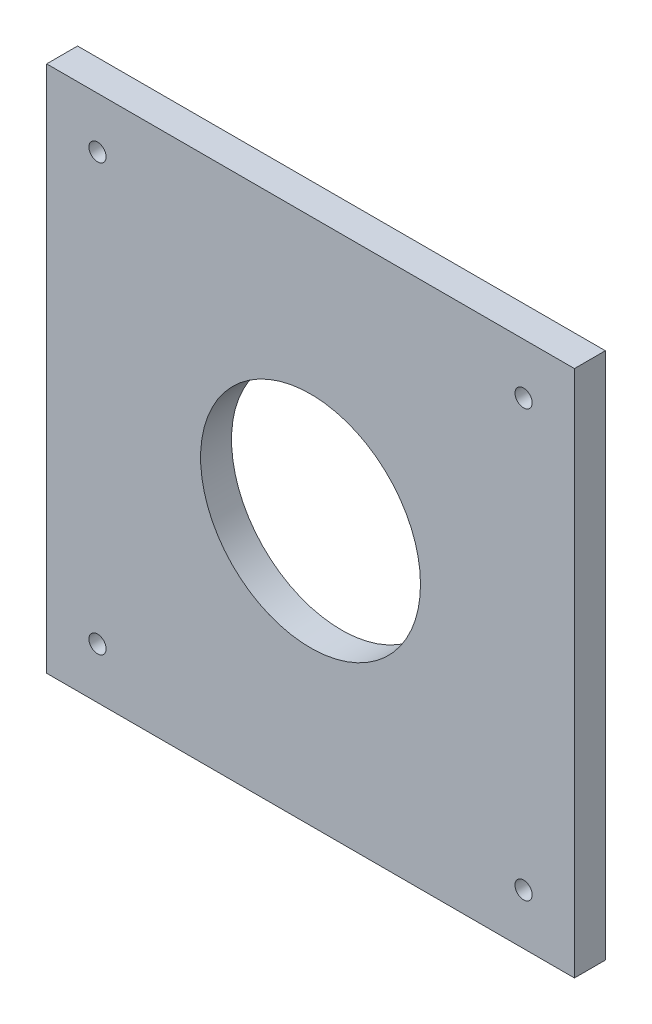
ISO-10303-21;
HEADER;
FILE_DESCRIPTION(('STEP AP214'),'2;1');
FILE_NAME('part.step','',(''),(''),'','','');
FILE_SCHEMA(('AUTOMOTIVE_DESIGN { 1 0 10303 214 1 1 1 1 }'));
ENDSEC;
DATA;
#1=APPLICATION_CONTEXT('core data for automotive mechanical design processes');
#2=APPLICATION_PROTOCOL_DEFINITION('international standard','automotive_design',2000,#1);
#3=PRODUCT_CONTEXT('',#1,'mechanical');
#4=PRODUCT('Part','Part','',(#3));
#5=PRODUCT_RELATED_PRODUCT_CATEGORY('part','',(#4));
#6=PRODUCT_DEFINITION_FORMATION('','',#4);
#7=PRODUCT_DEFINITION_CONTEXT('part definition',#1,'design');
#8=PRODUCT_DEFINITION('design','',#6,#7);
#9=PRODUCT_DEFINITION_SHAPE('','',#8);
#10=(LENGTH_UNIT() NAMED_UNIT(*) SI_UNIT(.MILLI.,.METRE.));
#11=(NAMED_UNIT(*) PLANE_ANGLE_UNIT() SI_UNIT($,.RADIAN.));
#12=(NAMED_UNIT(*) SI_UNIT($,.STERADIAN.) SOLID_ANGLE_UNIT());
#13=UNCERTAINTY_MEASURE_WITH_UNIT(LENGTH_MEASURE(1.E-05),#10,'distance_accuracy_value','');
#14=(GEOMETRIC_REPRESENTATION_CONTEXT(3) GLOBAL_UNCERTAINTY_ASSIGNED_CONTEXT((#13)) GLOBAL_UNIT_ASSIGNED_CONTEXT((#10,
#11,#12)) REPRESENTATION_CONTEXT('',''));
#15=CARTESIAN_POINT('',(0.,0.,0.));
#16=DIRECTION('',(0.,0.,1.));
#17=DIRECTION('',(1.,0.,0.));
#18=AXIS2_PLACEMENT_3D('',#15,#16,#17);
#19=CARTESIAN_POINT('',(0.,0.,4.5));
#20=DIRECTION('',(0.,0.,-1.));
#21=DIRECTION('',(-1.,0.,0.));
#22=AXIS2_PLACEMENT_3D('',#19,#20,#21);
#23=PLANE('',#22);
#24=DIRECTION('',(0.,-1.,0.));
#25=VECTOR('',#24,1.);
#26=CARTESIAN_POINT('',(0.,0.,4.5));
#27=LINE('',#26,#25);
#28=CARTESIAN_POINT('',(0.,76.8,4.5));
#29=VERTEX_POINT('',#28);
#30=CARTESIAN_POINT('',(0.,0.,4.5));
#31=VERTEX_POINT('',#30);
#32=EDGE_CURVE('E69',#29,#31,#27,.T.);
#33=ORIENTED_EDGE('',*,*,#32,.T.);
#34=DIRECTION('',(1.,0.,0.));
#35=VECTOR('',#34,1.);
#36=CARTESIAN_POINT('',(0.,0.,4.5));
#37=LINE('',#36,#35);
#38=CARTESIAN_POINT('',(76.8,0.,4.5));
#39=VERTEX_POINT('',#38);
#40=EDGE_CURVE('E64',#31,#39,#37,.T.);
#41=ORIENTED_EDGE('',*,*,#40,.T.);
#42=DIRECTION('',(0.,1.,0.));
#43=VECTOR('',#42,1.);
#44=CARTESIAN_POINT('',(76.8,0.,4.5));
#45=LINE('',#44,#43);
#46=CARTESIAN_POINT('',(76.8,76.8,4.5));
#47=VERTEX_POINT('',#46);
#48=EDGE_CURVE('E67',#39,#47,#45,.T.);
#49=ORIENTED_EDGE('',*,*,#48,.T.);
#50=DIRECTION('',(-1.,0.,0.));
#51=VECTOR('',#50,1.);
#52=CARTESIAN_POINT('',(0.,76.8,4.5));
#53=LINE('',#52,#51);
#54=EDGE_CURVE('E34',#47,#29,#53,.T.);
#55=ORIENTED_EDGE('',*,*,#54,.T.);
#56=EDGE_LOOP('',(#33,#41,#49,#55));
#57=FACE_BOUND('',#56,.T.);
#58=CARTESIAN_POINT('',(7.4,7.4,4.5));
#59=DIRECTION('',(0.,0.,1.));
#60=DIRECTION('',(1.,0.,0.));
#61=AXIS2_PLACEMENT_3D('',#58,#59,#60);
#62=CIRCLE('',#61,1.25);
#63=CARTESIAN_POINT('',(8.65,7.4,4.5));
#64=VERTEX_POINT('',#63);
#65=EDGE_CURVE('E84',#64,#64,#62,.T.);
#66=ORIENTED_EDGE('',*,*,#65,.F.);
#67=EDGE_LOOP('',(#66));
#68=FACE_BOUND('',#67,.T.);
#69=CARTESIAN_POINT('',(38.4,38.4,4.5));
#70=DIRECTION('',(0.,0.,1.));
#71=DIRECTION('',(1.,0.,0.));
#72=AXIS2_PLACEMENT_3D('',#69,#70,#71);
#73=CIRCLE('',#72,16.);
#74=CARTESIAN_POINT('',(54.4,38.4,4.5));
#75=VERTEX_POINT('',#74);
#76=EDGE_CURVE('E99',#75,#75,#73,.T.);
#77=ORIENTED_EDGE('',*,*,#76,.F.);
#78=EDGE_LOOP('',(#77));
#79=FACE_BOUND('',#78,.T.);
#80=CARTESIAN_POINT('',(69.4,7.4,4.5));
#81=DIRECTION('',(0.,0.,1.));
#82=DIRECTION('',(1.,0.,0.));
#83=AXIS2_PLACEMENT_3D('',#80,#81,#82);
#84=CIRCLE('',#83,1.25);
#85=CARTESIAN_POINT('',(70.65,7.4,4.5));
#86=VERTEX_POINT('',#85);
#87=EDGE_CURVE('E105',#86,#86,#84,.T.);
#88=ORIENTED_EDGE('',*,*,#87,.F.);
#89=EDGE_LOOP('',(#88));
#90=FACE_BOUND('',#89,.T.);
#91=CARTESIAN_POINT('',(69.4,69.4,4.5));
#92=DIRECTION('',(0.,0.,1.));
#93=DIRECTION('',(1.,0.,0.));
#94=AXIS2_PLACEMENT_3D('',#91,#92,#93);
#95=CIRCLE('',#94,1.25);
#96=CARTESIAN_POINT('',(70.65,69.4,4.5));
#97=VERTEX_POINT('',#96);
#98=EDGE_CURVE('E111',#97,#97,#95,.T.);
#99=ORIENTED_EDGE('',*,*,#98,.F.);
#100=EDGE_LOOP('',(#99));
#101=FACE_BOUND('',#100,.T.);
#102=CARTESIAN_POINT('',(7.39999999999979,69.4,4.5));
#103=DIRECTION('',(0.,0.,1.));
#104=DIRECTION('',(1.,0.,0.));
#105=AXIS2_PLACEMENT_3D('',#102,#103,#104);
#106=CIRCLE('',#105,1.25);
#107=CARTESIAN_POINT('',(8.64999999999979,69.4,4.5));
#108=VERTEX_POINT('',#107);
#109=EDGE_CURVE('E117',#108,#108,#106,.T.);
#110=ORIENTED_EDGE('',*,*,#109,.F.);
#111=EDGE_LOOP('',(#110));
#112=FACE_BOUND('',#111,.T.);
#113=ADVANCED_FACE('F17',(#57,#68,#79,#90,#101,#112),#23,.F.);
#114=CARTESIAN_POINT('',(0.,0.,0.));
#115=DIRECTION('',(0.,0.,-1.));
#116=DIRECTION('',(-1.,0.,0.));
#117=AXIS2_PLACEMENT_3D('',#114,#115,#116);
#118=PLANE('',#117);
#119=CARTESIAN_POINT('',(69.4,69.4,0.));
#120=DIRECTION('',(0.,0.,1.));
#121=DIRECTION('',(1.,0.,0.));
#122=AXIS2_PLACEMENT_3D('',#119,#120,#121);
#123=CIRCLE('',#122,1.25);
#124=CARTESIAN_POINT('',(70.65,69.4,0.));
#125=VERTEX_POINT('',#124);
#126=EDGE_CURVE('E114',#125,#125,#123,.T.);
#127=ORIENTED_EDGE('',*,*,#126,.T.);
#128=EDGE_LOOP('',(#127));
#129=FACE_BOUND('',#128,.T.);
#130=CARTESIAN_POINT('',(38.4,38.4,0.));
#131=DIRECTION('',(0.,0.,1.));
#132=DIRECTION('',(1.,0.,0.));
#133=AXIS2_PLACEMENT_3D('',#130,#131,#132);
#134=CIRCLE('',#133,16.);
#135=CARTESIAN_POINT('',(54.4,38.4,0.));
#136=VERTEX_POINT('',#135);
#137=EDGE_CURVE('E102',#136,#136,#134,.T.);
#138=ORIENTED_EDGE('',*,*,#137,.T.);
#139=EDGE_LOOP('',(#138));
#140=FACE_BOUND('',#139,.T.);
#141=DIRECTION('',(0.,-1.,0.));
#142=VECTOR('',#141,1.);
#143=CARTESIAN_POINT('',(0.,0.,0.));
#144=LINE('',#143,#142);
#145=CARTESIAN_POINT('',(0.,76.8,0.));
#146=VERTEX_POINT('',#145);
#147=CARTESIAN_POINT('',(0.,0.,0.));
#148=VERTEX_POINT('',#147);
#149=EDGE_CURVE('E81',#146,#148,#144,.T.);
#150=ORIENTED_EDGE('',*,*,#149,.F.);
#151=DIRECTION('',(-1.,0.,0.));
#152=VECTOR('',#151,1.);
#153=CARTESIAN_POINT('',(0.,76.8,0.));
#154=LINE('',#153,#152);
#155=CARTESIAN_POINT('',(76.8,76.8,0.));
#156=VERTEX_POINT('',#155);
#157=EDGE_CURVE('E57',#156,#146,#154,.T.);
#158=ORIENTED_EDGE('',*,*,#157,.F.);
#159=DIRECTION('',(0.,1.,0.));
#160=VECTOR('',#159,1.);
#161=CARTESIAN_POINT('',(76.8,0.,0.));
#162=LINE('',#161,#160);
#163=CARTESIAN_POINT('',(76.8,0.,0.));
#164=VERTEX_POINT('',#163);
#165=EDGE_CURVE('E51',#164,#156,#162,.T.);
#166=ORIENTED_EDGE('',*,*,#165,.F.);
#167=DIRECTION('',(1.,0.,0.));
#168=VECTOR('',#167,1.);
#169=CARTESIAN_POINT('',(0.,0.,0.));
#170=LINE('',#169,#168);
#171=EDGE_CURVE('E73',#148,#164,#170,.T.);
#172=ORIENTED_EDGE('',*,*,#171,.F.);
#173=EDGE_LOOP('',(#150,#158,#166,#172));
#174=FACE_BOUND('',#173,.T.);
#175=CARTESIAN_POINT('',(7.4,7.4,0.));
#176=DIRECTION('',(0.,0.,1.));
#177=DIRECTION('',(1.,0.,0.));
#178=AXIS2_PLACEMENT_3D('',#175,#176,#177);
#179=CIRCLE('',#178,1.25);
#180=CARTESIAN_POINT('',(8.65,7.4,0.));
#181=VERTEX_POINT('',#180);
#182=EDGE_CURVE('E96',#181,#181,#179,.T.);
#183=ORIENTED_EDGE('',*,*,#182,.T.);
#184=EDGE_LOOP('',(#183));
#185=FACE_BOUND('',#184,.T.);
#186=CARTESIAN_POINT('',(69.4,7.4,0.));
#187=DIRECTION('',(0.,0.,1.));
#188=DIRECTION('',(1.,0.,0.));
#189=AXIS2_PLACEMENT_3D('',#186,#187,#188);
#190=CIRCLE('',#189,1.25);
#191=CARTESIAN_POINT('',(70.65,7.4,0.));
#192=VERTEX_POINT('',#191);
#193=EDGE_CURVE('E108',#192,#192,#190,.T.);
#194=ORIENTED_EDGE('',*,*,#193,.T.);
#195=EDGE_LOOP('',(#194));
#196=FACE_BOUND('',#195,.T.);
#197=CARTESIAN_POINT('',(7.39999999999979,69.4,0.));
#198=DIRECTION('',(0.,0.,1.));
#199=DIRECTION('',(1.,0.,0.));
#200=AXIS2_PLACEMENT_3D('',#197,#198,#199);
#201=CIRCLE('',#200,1.25);
#202=CARTESIAN_POINT('',(8.64999999999979,69.4,0.));
#203=VERTEX_POINT('',#202);
#204=EDGE_CURVE('E120',#203,#203,#201,.T.);
#205=ORIENTED_EDGE('',*,*,#204,.T.);
#206=EDGE_LOOP('',(#205));
#207=FACE_BOUND('',#206,.T.);
#208=ADVANCED_FACE('F92',(#129,#140,#174,#185,#196,#207),#118,.T.);
#209=CARTESIAN_POINT('',(0.,0.,4.5));
#210=DIRECTION('',(1.,0.,0.));
#211=DIRECTION('',(0.,0.,-1.));
#212=AXIS2_PLACEMENT_3D('',#209,#210,#211);
#213=PLANE('',#212);
#214=ORIENTED_EDGE('',*,*,#149,.T.);
#215=DIRECTION('',(0.,0.,-1.));
#216=VECTOR('',#215,1.);
#217=CARTESIAN_POINT('',(0.,0.,4.5));
#218=LINE('',#217,#216);
#219=EDGE_CURVE('E11',#31,#148,#218,.T.);
#220=ORIENTED_EDGE('',*,*,#219,.F.);
#221=ORIENTED_EDGE('',*,*,#32,.F.);
#222=DIRECTION('',(0.,0.,-1.));
#223=VECTOR('',#222,1.);
#224=CARTESIAN_POINT('',(0.,76.8,4.5));
#225=LINE('',#224,#223);
#226=EDGE_CURVE('E77',#29,#146,#225,.T.);
#227=ORIENTED_EDGE('',*,*,#226,.T.);
#228=EDGE_LOOP('',(#214,#220,#221,#227));
#229=FACE_BOUND('',#228,.T.);
#230=ADVANCED_FACE('F19',(#229),#213,.F.);
#231=CARTESIAN_POINT('',(0.,0.,4.5));
#232=DIRECTION('',(0.,1.,0.));
#233=DIRECTION('',(0.,0.,1.));
#234=AXIS2_PLACEMENT_3D('',#231,#232,#233);
#235=PLANE('',#234);
#236=ORIENTED_EDGE('',*,*,#171,.T.);
#237=DIRECTION('',(0.,0.,-1.));
#238=VECTOR('',#237,1.);
#239=CARTESIAN_POINT('',(76.8,0.,4.5));
#240=LINE('',#239,#238);
#241=EDGE_CURVE('E26',#39,#164,#240,.T.);
#242=ORIENTED_EDGE('',*,*,#241,.F.);
#243=ORIENTED_EDGE('',*,*,#40,.F.);
#244=ORIENTED_EDGE('',*,*,#219,.T.);
#245=EDGE_LOOP('',(#236,#242,#243,#244));
#246=FACE_BOUND('',#245,.T.);
#247=ADVANCED_FACE('F72',(#246),#235,.F.);
#248=CARTESIAN_POINT('',(76.8,0.,4.5));
#249=DIRECTION('',(-1.,0.,0.));
#250=DIRECTION('',(0.,0.,1.));
#251=AXIS2_PLACEMENT_3D('',#248,#249,#250);
#252=PLANE('',#251);
#253=ORIENTED_EDGE('',*,*,#165,.T.);
#254=DIRECTION('',(0.,0.,-1.));
#255=VECTOR('',#254,1.);
#256=CARTESIAN_POINT('',(76.8,76.8,4.5));
#257=LINE('',#256,#255);
#258=EDGE_CURVE('E74',#47,#156,#257,.T.);
#259=ORIENTED_EDGE('',*,*,#258,.F.);
#260=ORIENTED_EDGE('',*,*,#48,.F.);
#261=ORIENTED_EDGE('',*,*,#241,.T.);
#262=EDGE_LOOP('',(#253,#259,#260,#261));
#263=FACE_BOUND('',#262,.T.);
#264=ADVANCED_FACE('F75',(#263),#252,.F.);
#265=CARTESIAN_POINT('',(0.,76.8,4.5));
#266=DIRECTION('',(0.,-1.,0.));
#267=DIRECTION('',(0.,0.,-1.));
#268=AXIS2_PLACEMENT_3D('',#265,#266,#267);
#269=PLANE('',#268);
#270=ORIENTED_EDGE('',*,*,#157,.T.);
#271=ORIENTED_EDGE('',*,*,#226,.F.);
#272=ORIENTED_EDGE('',*,*,#54,.F.);
#273=ORIENTED_EDGE('',*,*,#258,.T.);
#274=EDGE_LOOP('',(#270,#271,#272,#273));
#275=FACE_BOUND('',#274,.T.);
#276=ADVANCED_FACE('F89',(#275),#269,.F.);
#277=CARTESIAN_POINT('',(7.4,7.4,4.5));
#278=DIRECTION('',(0.,0.,-1.));
#279=DIRECTION('',(-1.,0.,0.));
#280=AXIS2_PLACEMENT_3D('',#277,#278,#279);
#281=CYLINDRICAL_SURFACE('',#280,1.25);
#282=ORIENTED_EDGE('',*,*,#65,.T.);
#283=EDGE_LOOP('',(#282));
#284=FACE_BOUND('',#283,.T.);
#285=ORIENTED_EDGE('',*,*,#182,.F.);
#286=EDGE_LOOP('',(#285));
#287=FACE_BOUND('',#286,.T.);
#288=ADVANCED_FACE('F139',(#284,#287),#281,.F.);
#289=CARTESIAN_POINT('',(38.4,38.4,4.5));
#290=DIRECTION('',(0.,0.,-1.));
#291=DIRECTION('',(-1.,0.,0.));
#292=AXIS2_PLACEMENT_3D('',#289,#290,#291);
#293=CYLINDRICAL_SURFACE('',#292,16.);
#294=ORIENTED_EDGE('',*,*,#76,.T.);
#295=EDGE_LOOP('',(#294));
#296=FACE_BOUND('',#295,.T.);
#297=ORIENTED_EDGE('',*,*,#137,.F.);
#298=EDGE_LOOP('',(#297));
#299=FACE_BOUND('',#298,.T.);
#300=ADVANCED_FACE('F188',(#296,#299),#293,.F.);
#301=CARTESIAN_POINT('',(69.4,7.4,4.5));
#302=DIRECTION('',(0.,0.,-1.));
#303=DIRECTION('',(-1.,0.,0.));
#304=AXIS2_PLACEMENT_3D('',#301,#302,#303);
#305=CYLINDRICAL_SURFACE('',#304,1.25);
#306=ORIENTED_EDGE('',*,*,#87,.T.);
#307=EDGE_LOOP('',(#306));
#308=FACE_BOUND('',#307,.T.);
#309=ORIENTED_EDGE('',*,*,#193,.F.);
#310=EDGE_LOOP('',(#309));
#311=FACE_BOUND('',#310,.T.);
#312=ADVANCED_FACE('F195',(#308,#311),#305,.F.);
#313=CARTESIAN_POINT('',(69.4,69.4,4.5));
#314=DIRECTION('',(0.,0.,-1.));
#315=DIRECTION('',(-1.,0.,0.));
#316=AXIS2_PLACEMENT_3D('',#313,#314,#315);
#317=CYLINDRICAL_SURFACE('',#316,1.25);
#318=ORIENTED_EDGE('',*,*,#98,.T.);
#319=EDGE_LOOP('',(#318));
#320=FACE_BOUND('',#319,.T.);
#321=ORIENTED_EDGE('',*,*,#126,.F.);
#322=EDGE_LOOP('',(#321));
#323=FACE_BOUND('',#322,.T.);
#324=ADVANCED_FACE('F202',(#320,#323),#317,.F.);
#325=CARTESIAN_POINT('',(7.39999999999979,69.4,4.5));
#326=DIRECTION('',(0.,0.,-1.));
#327=DIRECTION('',(-1.,0.,0.));
#328=AXIS2_PLACEMENT_3D('',#325,#326,#327);
#329=CYLINDRICAL_SURFACE('',#328,1.25);
#330=ORIENTED_EDGE('',*,*,#109,.T.);
#331=EDGE_LOOP('',(#330));
#332=FACE_BOUND('',#331,.T.);
#333=ORIENTED_EDGE('',*,*,#204,.F.);
#334=EDGE_LOOP('',(#333));
#335=FACE_BOUND('',#334,.T.);
#336=ADVANCED_FACE('F126',(#332,#335),#329,.F.);
#337=CLOSED_SHELL('',(#113,#208,#230,#247,#264,#276,#288,#300,#312,#324,#336));
#338=MANIFOLD_SOLID_BREP('B1',#337);
#339=ADVANCED_BREP_SHAPE_REPRESENTATION('',(#18,#338),#14);
#340=SHAPE_DEFINITION_REPRESENTATION(#9,#339);
ENDSEC;
END-ISO-10303-21;
